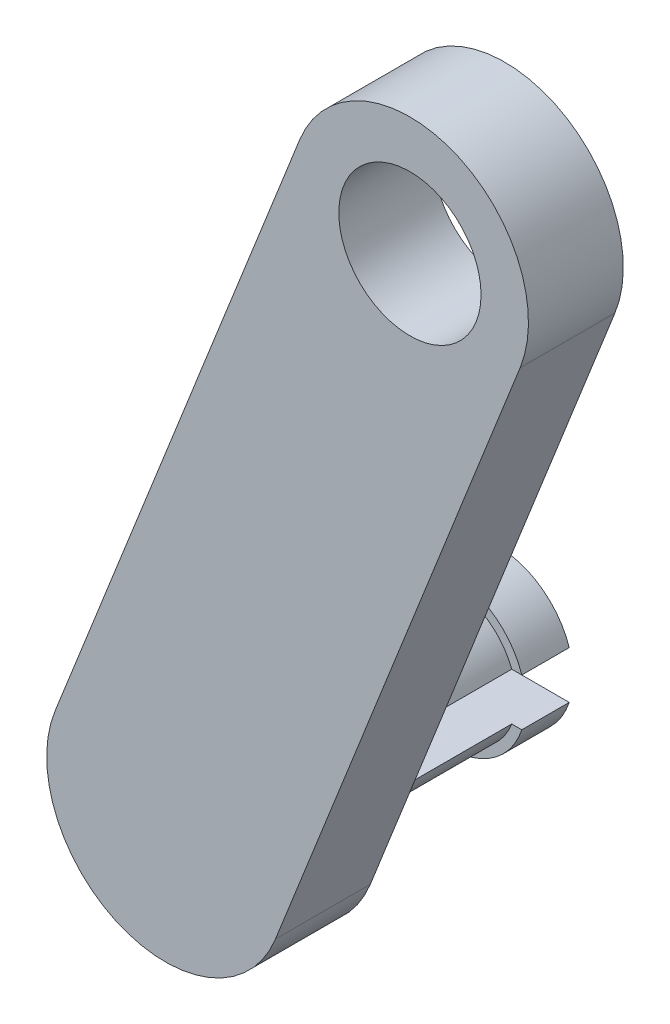
ISO-10303-21;
HEADER;
FILE_DESCRIPTION(('STEP AP214'),'2;1');
FILE_NAME('part.step','',(''),(''),'','','');
FILE_SCHEMA(('AUTOMOTIVE_DESIGN { 1 0 10303 214 1 1 1 1 }'));
ENDSEC;
DATA;
#1=APPLICATION_CONTEXT('core data for automotive mechanical design processes');
#2=APPLICATION_PROTOCOL_DEFINITION('international standard','automotive_design',2000,#1);
#3=PRODUCT_CONTEXT('',#1,'mechanical');
#4=PRODUCT('Part','Part','',(#3));
#5=PRODUCT_RELATED_PRODUCT_CATEGORY('part','',(#4));
#6=PRODUCT_DEFINITION_FORMATION('','',#4);
#7=PRODUCT_DEFINITION_CONTEXT('part definition',#1,'design');
#8=PRODUCT_DEFINITION('design','',#6,#7);
#9=PRODUCT_DEFINITION_SHAPE('','',#8);
#10=(LENGTH_UNIT() NAMED_UNIT(*) SI_UNIT(.MILLI.,.METRE.));
#11=(NAMED_UNIT(*) PLANE_ANGLE_UNIT() SI_UNIT($,.RADIAN.));
#12=(NAMED_UNIT(*) SI_UNIT($,.STERADIAN.) SOLID_ANGLE_UNIT());
#13=UNCERTAINTY_MEASURE_WITH_UNIT(LENGTH_MEASURE(1.E-05),#10,'distance_accuracy_value','');
#14=(GEOMETRIC_REPRESENTATION_CONTEXT(3) GLOBAL_UNCERTAINTY_ASSIGNED_CONTEXT((#13)) GLOBAL_UNIT_ASSIGNED_CONTEXT((#10,
#11,#12)) REPRESENTATION_CONTEXT('',''));
#15=CARTESIAN_POINT('',(0.,0.,0.));
#16=DIRECTION('',(0.,0.,1.));
#17=DIRECTION('',(1.,0.,0.));
#18=AXIS2_PLACEMENT_3D('',#15,#16,#17);
#19=CARTESIAN_POINT('',(-21.1598617150901,-14.0144468603605,-4.));
#20=DIRECTION('',(0.,0.,1.));
#21=DIRECTION('',(1.,0.,0.));
#22=AXIS2_PLACEMENT_3D('',#19,#20,#21);
#23=CYLINDRICAL_SURFACE('',#22,1.4);
#24=CARTESIAN_POINT('',(-21.1598617150901,-14.0144468603605,-4.));
#25=DIRECTION('',(0.,0.,-1.));
#26=DIRECTION('',(-1.,0.,0.));
#27=AXIS2_PLACEMENT_3D('',#24,#25,#26);
#28=CIRCLE('',#27,1.4);
#29=CARTESIAN_POINT('',(-22.4675313981523,-13.5144468603605,-4.));
#30=VERTEX_POINT('',#29);
#31=CARTESIAN_POINT('',(-19.8521920320279,-13.5144468603605,-4.));
#32=VERTEX_POINT('',#31);
#33=EDGE_CURVE('E166',#30,#32,#28,.T.);
#34=ORIENTED_EDGE('',*,*,#33,.F.);
#35=DIRECTION('',(0.,0.,1.));
#36=VECTOR('',#35,1.);
#37=CARTESIAN_POINT('',(-22.4675313981523,-13.5144468603605,-4.));
#38=LINE('',#37,#36);
#39=CARTESIAN_POINT('',(-22.4675313981523,-13.5144468603605,0.));
#40=VERTEX_POINT('',#39);
#41=EDGE_CURVE('E163',#30,#40,#38,.T.);
#42=ORIENTED_EDGE('',*,*,#41,.T.);
#43=CARTESIAN_POINT('',(-21.1598617150901,-14.0144468603605,0.));
#44=DIRECTION('',(0.,0.,1.));
#45=DIRECTION('',(1.,0.,0.));
#46=AXIS2_PLACEMENT_3D('',#43,#44,#45);
#47=CIRCLE('',#46,1.4);
#48=CARTESIAN_POINT('',(-19.8521920320279,-13.5144468603605,0.));
#49=VERTEX_POINT('',#48);
#50=EDGE_CURVE('E196',#40,#49,#47,.F.);
#51=ORIENTED_EDGE('',*,*,#50,.T.);
#52=DIRECTION('',(0.,0.,1.));
#53=VECTOR('',#52,1.);
#54=CARTESIAN_POINT('',(-19.8521920320279,-13.5144468603605,-4.));
#55=LINE('',#54,#53);
#56=EDGE_CURVE('E220',#49,#32,#55,.F.);
#57=ORIENTED_EDGE('',*,*,#56,.T.);
#58=EDGE_LOOP('',(#34,#42,#51,#57));
#59=FACE_BOUND('',#58,.T.);
#60=ADVANCED_FACE('F37',(#59),#23,.T.);
#61=CARTESIAN_POINT('',(-21.1598617150901,-14.0144468603605,-5.));
#62=DIRECTION('',(0.,0.,1.));
#63=DIRECTION('',(1.,0.,0.));
#64=AXIS2_PLACEMENT_3D('',#61,#62,#63);
#65=CYLINDRICAL_SURFACE('',#64,1.6);
#66=CARTESIAN_POINT('',(-21.1598617150901,-14.0144468603605,-5.));
#67=DIRECTION('',(0.,0.,-1.));
#68=DIRECTION('',(-1.,0.,0.));
#69=AXIS2_PLACEMENT_3D('',#66,#67,#68);
#70=CIRCLE('',#69,1.6);
#71=CARTESIAN_POINT('',(-22.6797301304472,-13.5144468603605,-5.));
#72=VERTEX_POINT('',#71);
#73=CARTESIAN_POINT('',(-19.6399932997331,-13.5144468603605,-5.));
#74=VERTEX_POINT('',#73);
#75=EDGE_CURVE('E154',#72,#74,#70,.T.);
#76=ORIENTED_EDGE('',*,*,#75,.F.);
#77=DIRECTION('',(0.,0.,1.));
#78=VECTOR('',#77,1.);
#79=CARTESIAN_POINT('',(-22.6797301304472,-13.5144468603605,-5.));
#80=LINE('',#79,#78);
#81=CARTESIAN_POINT('',(-22.6797301304472,-13.5144468603605,-4.));
#82=VERTEX_POINT('',#81);
#83=EDGE_CURVE('E218',#72,#82,#80,.T.);
#84=ORIENTED_EDGE('',*,*,#83,.T.);
#85=CARTESIAN_POINT('',(-21.1598617150901,-14.0144468603605,-4.));
#86=DIRECTION('',(0.,0.,-1.));
#87=DIRECTION('',(-1.,0.,0.));
#88=AXIS2_PLACEMENT_3D('',#85,#86,#87);
#89=CIRCLE('',#88,1.6);
#90=CARTESIAN_POINT('',(-19.6399932997331,-13.5144468603605,-4.));
#91=VERTEX_POINT('',#90);
#92=EDGE_CURVE('E155',#82,#91,#89,.T.);
#93=ORIENTED_EDGE('',*,*,#92,.T.);
#94=DIRECTION('',(0.,0.,1.));
#95=VECTOR('',#94,1.);
#96=CARTESIAN_POINT('',(-19.6399932997331,-13.5144468603605,-5.));
#97=LINE('',#96,#95);
#98=EDGE_CURVE('E217',#91,#74,#97,.F.);
#99=ORIENTED_EDGE('',*,*,#98,.T.);
#100=EDGE_LOOP('',(#76,#84,#93,#99));
#101=FACE_BOUND('',#100,.T.);
#102=ADVANCED_FACE('F216',(#101),#65,.T.);
#103=CARTESIAN_POINT('',(-21.1598617150901,-14.0144468603605,-5.));
#104=DIRECTION('',(0.,0.,-1.));
#105=DIRECTION('',(-1.,0.,0.));
#106=AXIS2_PLACEMENT_3D('',#103,#104,#105);
#107=PLANE('',#106);
#108=DIRECTION('',(1.,0.,0.));
#109=VECTOR('',#108,1.);
#110=CARTESIAN_POINT('',(-19.1598617150901,-13.5144468603605,-5.));
#111=LINE('',#110,#109);
#112=EDGE_CURVE('E151',#72,#74,#111,.T.);
#113=ORIENTED_EDGE('',*,*,#112,.F.);
#114=ORIENTED_EDGE('',*,*,#75,.T.);
#115=EDGE_LOOP('',(#113,#114));
#116=FACE_BOUND('',#115,.T.);
#117=ADVANCED_FACE('F252',(#116),#107,.T.);
#118=CARTESIAN_POINT('',(-21.1598617150901,-14.0144468603605,-4.));
#119=DIRECTION('',(0.,0.,-1.));
#120=DIRECTION('',(-1.,0.,0.));
#121=AXIS2_PLACEMENT_3D('',#118,#119,#120);
#122=PLANE('',#121);
#123=ORIENTED_EDGE('',*,*,#92,.F.);
#124=DIRECTION('',(1.,0.,0.));
#125=VECTOR('',#124,1.);
#126=CARTESIAN_POINT('',(-21.1598617150901,-13.5144468603605,-4.));
#127=LINE('',#126,#125);
#128=EDGE_CURVE('E11',#82,#30,#127,.T.);
#129=ORIENTED_EDGE('',*,*,#128,.T.);
#130=ORIENTED_EDGE('',*,*,#33,.T.);
#131=EDGE_CURVE('E41',#32,#91,#127,.T.);
#132=ORIENTED_EDGE('',*,*,#131,.T.);
#133=EDGE_LOOP('',(#123,#129,#130,#132));
#134=FACE_BOUND('',#133,.T.);
#135=ADVANCED_FACE('F208',(#134),#122,.F.);
#136=CARTESIAN_POINT('',(-16.,-1.,2.));
#137=DIRECTION('',(0.,0.,-1.));
#138=DIRECTION('',(-1.,0.,0.));
#139=AXIS2_PLACEMENT_3D('',#136,#137,#138);
#140=CYLINDRICAL_SURFACE('',#139,2.50000000000001);
#141=CARTESIAN_POINT('',(-16.,-1.,0.));
#142=DIRECTION('',(0.,0.,1.));
#143=DIRECTION('',(1.,0.,0.));
#144=AXIS2_PLACEMENT_3D('',#141,#142,#143);
#145=CIRCLE('',#144,2.50000000000001);
#146=CARTESIAN_POINT('',(-13.6759916320785,-1.92140387769467,0.));
#147=VERTEX_POINT('',#146);
#148=CARTESIAN_POINT('',(-18.3240083679215,-0.0785961223053345,0.));
#149=VERTEX_POINT('',#148);
#150=EDGE_CURVE('E180',#147,#149,#145,.T.);
#151=ORIENTED_EDGE('',*,*,#150,.T.);
#152=DIRECTION('',(0.,0.,-1.));
#153=VECTOR('',#152,1.);
#154=CARTESIAN_POINT('',(-18.3240083679215,-0.0785961223053345,2.));
#155=LINE('',#154,#153);
#156=CARTESIAN_POINT('',(-18.3240083679215,-0.0785961223053345,2.));
#157=VERTEX_POINT('',#156);
#158=EDGE_CURVE('E194',#157,#149,#155,.T.);
#159=ORIENTED_EDGE('',*,*,#158,.F.);
#160=CARTESIAN_POINT('',(-16.,-1.,2.));
#161=DIRECTION('',(0.,0.,1.));
#162=DIRECTION('',(1.,0.,0.));
#163=AXIS2_PLACEMENT_3D('',#160,#161,#162);
#164=CIRCLE('',#163,2.50000000000001);
#165=CARTESIAN_POINT('',(-13.6759916320785,-1.92140387769467,2.));
#166=VERTEX_POINT('',#165);
#167=EDGE_CURVE('E173',#166,#157,#164,.T.);
#168=ORIENTED_EDGE('',*,*,#167,.F.);
#169=DIRECTION('',(0.,0.,-1.));
#170=VECTOR('',#169,1.);
#171=CARTESIAN_POINT('',(-13.6759916320785,-1.92140387769467,2.));
#172=LINE('',#171,#170);
#173=EDGE_CURVE('E179',#166,#147,#172,.T.);
#174=ORIENTED_EDGE('',*,*,#173,.T.);
#175=EDGE_LOOP('',(#151,#159,#168,#174));
#176=FACE_BOUND('',#175,.T.);
#177=ADVANCED_FACE('F39',(#176),#140,.T.);
#178=CARTESIAN_POINT('',(-18.3240083679215,-0.0785961223053345,2.));
#179=DIRECTION('',(0.929603347168607,-0.368561551077866,0.));
#180=DIRECTION('',(0.368561551077866,0.929603347168607,0.));
#181=AXIS2_PLACEMENT_3D('',#178,#179,#180);
#182=PLANE('',#181);
#183=DIRECTION('',(-0.368561551077866,-0.929603347168607,0.));
#184=VECTOR('',#183,1.);
#185=CARTESIAN_POINT('',(-18.3240083679215,-0.0785961223053345,0.));
#186=LINE('',#185,#184);
#187=CARTESIAN_POINT('',(-23.4838700830116,-13.0930429826658,0.));
#188=VERTEX_POINT('',#187);
#189=EDGE_CURVE('E183',#149,#188,#186,.T.);
#190=ORIENTED_EDGE('',*,*,#189,.T.);
#191=DIRECTION('',(0.,0.,-1.));
#192=VECTOR('',#191,1.);
#193=CARTESIAN_POINT('',(-23.4838700830116,-13.0930429826658,2.));
#194=LINE('',#193,#192);
#195=CARTESIAN_POINT('',(-23.4838700830116,-13.0930429826658,2.));
#196=VERTEX_POINT('',#195);
#197=EDGE_CURVE('E191',#196,#188,#194,.T.);
#198=ORIENTED_EDGE('',*,*,#197,.F.);
#199=DIRECTION('',(-0.368561551077866,-0.929603347168607,0.));
#200=VECTOR('',#199,1.);
#201=CARTESIAN_POINT('',(-18.3240083679215,-0.0785961223053345,2.));
#202=LINE('',#201,#200);
#203=EDGE_CURVE('E90',#157,#196,#202,.T.);
#204=ORIENTED_EDGE('',*,*,#203,.F.);
#205=ORIENTED_EDGE('',*,*,#158,.T.);
#206=EDGE_LOOP('',(#190,#198,#204,#205));
#207=FACE_BOUND('',#206,.T.);
#208=ADVANCED_FACE('F285',(#207),#182,.F.);
#209=CARTESIAN_POINT('',(-21.1598617150901,-14.0144468603605,2.));
#210=DIRECTION('',(0.,0.,-1.));
#211=DIRECTION('',(-1.,0.,0.));
#212=AXIS2_PLACEMENT_3D('',#209,#210,#211);
#213=CYLINDRICAL_SURFACE('',#212,2.50000000000001);
#214=CARTESIAN_POINT('',(-21.1598617150901,-14.0144468603605,0.));
#215=DIRECTION('',(0.,0.,1.));
#216=DIRECTION('',(1.,0.,0.));
#217=AXIS2_PLACEMENT_3D('',#214,#215,#216);
#218=CIRCLE('',#217,2.50000000000001);
#219=CARTESIAN_POINT('',(-18.8358533471686,-14.9358507380552,0.));
#220=VERTEX_POINT('',#219);
#221=EDGE_CURVE('E185',#188,#220,#218,.T.);
#222=ORIENTED_EDGE('',*,*,#221,.T.);
#223=DIRECTION('',(0.,0.,-1.));
#224=VECTOR('',#223,1.);
#225=CARTESIAN_POINT('',(-18.8358533471686,-14.9358507380552,2.));
#226=LINE('',#225,#224);
#227=CARTESIAN_POINT('',(-18.8358533471686,-14.9358507380552,2.));
#228=VERTEX_POINT('',#227);
#229=EDGE_CURVE('E189',#228,#220,#226,.T.);
#230=ORIENTED_EDGE('',*,*,#229,.F.);
#231=CARTESIAN_POINT('',(-21.1598617150901,-14.0144468603605,2.));
#232=DIRECTION('',(0.,0.,1.));
#233=DIRECTION('',(1.,0.,0.));
#234=AXIS2_PLACEMENT_3D('',#231,#232,#233);
#235=CIRCLE('',#234,2.50000000000001);
#236=EDGE_CURVE('E176',#196,#228,#235,.T.);
#237=ORIENTED_EDGE('',*,*,#236,.F.);
#238=ORIENTED_EDGE('',*,*,#197,.T.);
#239=EDGE_LOOP('',(#222,#230,#237,#238));
#240=FACE_BOUND('',#239,.T.);
#241=ADVANCED_FACE('F283',(#240),#213,.T.);
#242=CARTESIAN_POINT('',(-13.6759916320785,-1.92140387769467,2.));
#243=DIRECTION('',(-0.929603347168607,0.368561551077866,0.));
#244=DIRECTION('',(-0.368561551077866,-0.929603347168607,0.));
#245=AXIS2_PLACEMENT_3D('',#242,#243,#244);
#246=PLANE('',#245);
#247=DIRECTION('',(0.368561551077866,0.929603347168607,0.));
#248=VECTOR('',#247,1.);
#249=CARTESIAN_POINT('',(-13.6759916320785,-1.92140387769467,0.));
#250=LINE('',#249,#248);
#251=EDGE_CURVE('E82',#220,#147,#250,.T.);
#252=ORIENTED_EDGE('',*,*,#251,.T.);
#253=ORIENTED_EDGE('',*,*,#173,.F.);
#254=DIRECTION('',(0.368561551077866,0.929603347168607,0.));
#255=VECTOR('',#254,1.);
#256=CARTESIAN_POINT('',(-13.6759916320785,-1.92140387769467,2.));
#257=LINE('',#256,#255);
#258=EDGE_CURVE('E61',#228,#166,#257,.T.);
#259=ORIENTED_EDGE('',*,*,#258,.F.);
#260=ORIENTED_EDGE('',*,*,#229,.T.);
#261=EDGE_LOOP('',(#252,#253,#259,#260));
#262=FACE_BOUND('',#261,.T.);
#263=ADVANCED_FACE('F278',(#262),#246,.F.);
#264=CARTESIAN_POINT('',(-16.,-1.,2.));
#265=DIRECTION('',(0.,0.,1.));
#266=DIRECTION('',(1.,0.,0.));
#267=AXIS2_PLACEMENT_3D('',#264,#265,#266);
#268=PLANE('',#267);
#269=CARTESIAN_POINT('',(-16.,-1.,2.));
#270=DIRECTION('',(0.,0.,1.));
#271=DIRECTION('',(1.,0.,0.));
#272=AXIS2_PLACEMENT_3D('',#269,#270,#271);
#273=CIRCLE('',#272,1.5);
#274=CARTESIAN_POINT('',(-14.5,-1.,2.));
#275=VERTEX_POINT('',#274);
#276=EDGE_CURVE('E169',#275,#275,#273,.T.);
#277=ORIENTED_EDGE('',*,*,#276,.F.);
#278=EDGE_LOOP('',(#277));
#279=FACE_BOUND('',#278,.T.);
#280=ORIENTED_EDGE('',*,*,#167,.T.);
#281=ORIENTED_EDGE('',*,*,#203,.T.);
#282=ORIENTED_EDGE('',*,*,#236,.T.);
#283=ORIENTED_EDGE('',*,*,#258,.T.);
#284=EDGE_LOOP('',(#280,#281,#282,#283));
#285=FACE_BOUND('',#284,.T.);
#286=ADVANCED_FACE('F272',(#279,#285),#268,.T.);
#287=CARTESIAN_POINT('',(-16.,-1.,0.));
#288=DIRECTION('',(0.,0.,1.));
#289=DIRECTION('',(1.,0.,0.));
#290=AXIS2_PLACEMENT_3D('',#287,#288,#289);
#291=PLANE('',#290);
#292=DIRECTION('',(1.,0.,0.));
#293=VECTOR('',#292,1.);
#294=CARTESIAN_POINT('',(-19.1598617150901,-13.5144468603605,0.));
#295=LINE('',#294,#293);
#296=EDGE_CURVE('E230',#40,#49,#295,.T.);
#297=ORIENTED_EDGE('',*,*,#296,.T.);
#298=ORIENTED_EDGE('',*,*,#50,.F.);
#299=EDGE_LOOP('',(#297,#298));
#300=FACE_BOUND('',#299,.T.);
#301=DIRECTION('',(-1.,0.,0.));
#302=VECTOR('',#301,1.);
#303=CARTESIAN_POINT('',(-19.1598617150901,-14.5144468603605,0.));
#304=LINE('',#303,#302);
#305=CARTESIAN_POINT('',(-19.8521920320279,-14.5144468603605,0.));
#306=VERTEX_POINT('',#305);
#307=CARTESIAN_POINT('',(-22.4675313981523,-14.5144468603605,0.));
#308=VERTEX_POINT('',#307);
#309=EDGE_CURVE('E231',#306,#308,#304,.T.);
#310=ORIENTED_EDGE('',*,*,#309,.T.);
#311=EDGE_CURVE('E199',#306,#308,#47,.F.);
#312=ORIENTED_EDGE('',*,*,#311,.F.);
#313=EDGE_LOOP('',(#310,#312));
#314=FACE_BOUND('',#313,.T.);
#315=CARTESIAN_POINT('',(-16.,-1.,0.));
#316=DIRECTION('',(0.,0.,1.));
#317=DIRECTION('',(1.,0.,0.));
#318=AXIS2_PLACEMENT_3D('',#315,#316,#317);
#319=CIRCLE('',#318,1.5);
#320=CARTESIAN_POINT('',(-14.5,-1.,0.));
#321=VERTEX_POINT('',#320);
#322=EDGE_CURVE('E172',#321,#321,#319,.T.);
#323=ORIENTED_EDGE('',*,*,#322,.T.);
#324=EDGE_LOOP('',(#323));
#325=FACE_BOUND('',#324,.T.);
#326=ORIENTED_EDGE('',*,*,#150,.F.);
#327=ORIENTED_EDGE('',*,*,#251,.F.);
#328=ORIENTED_EDGE('',*,*,#221,.F.);
#329=ORIENTED_EDGE('',*,*,#189,.F.);
#330=EDGE_LOOP('',(#326,#327,#328,#329));
#331=FACE_BOUND('',#330,.T.);
#332=ADVANCED_FACE('F238',(#300,#314,#325,#331),#291,.F.);
#333=CARTESIAN_POINT('',(-16.,-1.,-1.));
#334=DIRECTION('',(0.,0.,1.));
#335=DIRECTION('',(1.,0.,0.));
#336=AXIS2_PLACEMENT_3D('',#333,#334,#335);
#337=CYLINDRICAL_SURFACE('',#336,1.5);
#338=ORIENTED_EDGE('',*,*,#276,.T.);
#339=EDGE_LOOP('',(#338));
#340=FACE_BOUND('',#339,.T.);
#341=ORIENTED_EDGE('',*,*,#322,.F.);
#342=EDGE_LOOP('',(#341));
#343=FACE_BOUND('',#342,.T.);
#344=ADVANCED_FACE('F263',(#340,#343),#337,.F.);
#345=CARTESIAN_POINT('',(-19.8521920320279,-14.5144468603605,-4.));
#346=VERTEX_POINT('',#345);
#347=CARTESIAN_POINT('',(-22.4675313981523,-14.5144468603605,-4.));
#348=VERTEX_POINT('',#347);
#349=EDGE_CURVE('E158',#346,#348,#28,.T.);
#350=ORIENTED_EDGE('',*,*,#349,.F.);
#351=DIRECTION('',(0.,0.,1.));
#352=VECTOR('',#351,1.);
#353=CARTESIAN_POINT('',(-19.8521920320279,-14.5144468603605,-4.));
#354=LINE('',#353,#352);
#355=EDGE_CURVE('E144',#346,#306,#354,.T.);
#356=ORIENTED_EDGE('',*,*,#355,.T.);
#357=ORIENTED_EDGE('',*,*,#311,.T.);
#358=DIRECTION('',(0.,0.,1.));
#359=VECTOR('',#358,1.);
#360=CARTESIAN_POINT('',(-22.4675313981523,-14.5144468603605,-4.));
#361=LINE('',#360,#359);
#362=EDGE_CURVE('E145',#308,#348,#361,.F.);
#363=ORIENTED_EDGE('',*,*,#362,.T.);
#364=EDGE_LOOP('',(#350,#356,#357,#363));
#365=FACE_BOUND('',#364,.T.);
#366=ADVANCED_FACE('F241',(#365),#23,.T.);
#367=CARTESIAN_POINT('',(-19.6399932997331,-14.5144468603605,-5.));
#368=VERTEX_POINT('',#367);
#369=CARTESIAN_POINT('',(-22.6797301304472,-14.5144468603605,-5.));
#370=VERTEX_POINT('',#369);
#371=EDGE_CURVE('E150',#368,#370,#70,.T.);
#372=ORIENTED_EDGE('',*,*,#371,.F.);
#373=DIRECTION('',(0.,0.,1.));
#374=VECTOR('',#373,1.);
#375=CARTESIAN_POINT('',(-19.6399932997331,-14.5144468603605,-5.));
#376=LINE('',#375,#374);
#377=CARTESIAN_POINT('',(-19.6399932997331,-14.5144468603605,-4.));
#378=VERTEX_POINT('',#377);
#379=EDGE_CURVE('E134',#368,#378,#376,.T.);
#380=ORIENTED_EDGE('',*,*,#379,.T.);
#381=CARTESIAN_POINT('',(-22.6797301304472,-14.5144468603605,-4.));
#382=VERTEX_POINT('',#381);
#383=EDGE_CURVE('E160',#378,#382,#89,.T.);
#384=ORIENTED_EDGE('',*,*,#383,.T.);
#385=DIRECTION('',(0.,0.,1.));
#386=VECTOR('',#385,1.);
#387=CARTESIAN_POINT('',(-22.6797301304472,-14.5144468603605,-5.));
#388=LINE('',#387,#386);
#389=EDGE_CURVE('E52',#382,#370,#388,.F.);
#390=ORIENTED_EDGE('',*,*,#389,.T.);
#391=EDGE_LOOP('',(#372,#380,#384,#390));
#392=FACE_BOUND('',#391,.T.);
#393=ADVANCED_FACE('F153',(#392),#65,.T.);
#394=DIRECTION('',(-1.,0.,0.));
#395=VECTOR('',#394,1.);
#396=CARTESIAN_POINT('',(-19.1598617150901,-14.5144468603605,-5.));
#397=LINE('',#396,#395);
#398=EDGE_CURVE('E137',#368,#370,#397,.T.);
#399=ORIENTED_EDGE('',*,*,#398,.F.);
#400=ORIENTED_EDGE('',*,*,#371,.T.);
#401=EDGE_LOOP('',(#399,#400));
#402=FACE_BOUND('',#401,.T.);
#403=ADVANCED_FACE('F149',(#402),#107,.T.);
#404=ORIENTED_EDGE('',*,*,#383,.F.);
#405=DIRECTION('',(-1.,0.,0.));
#406=VECTOR('',#405,1.);
#407=CARTESIAN_POINT('',(-21.1598617150901,-14.5144468603605,-4.));
#408=LINE('',#407,#406);
#409=EDGE_CURVE('E139',#378,#346,#408,.T.);
#410=ORIENTED_EDGE('',*,*,#409,.T.);
#411=ORIENTED_EDGE('',*,*,#349,.T.);
#412=EDGE_CURVE('E201',#348,#382,#408,.T.);
#413=ORIENTED_EDGE('',*,*,#412,.T.);
#414=EDGE_LOOP('',(#404,#410,#411,#413));
#415=FACE_BOUND('',#414,.T.);
#416=ADVANCED_FACE('F242',(#415),#122,.F.);
#417=CARTESIAN_POINT('',(-19.1598617150901,-13.5144468603605,0.));
#418=DIRECTION('',(0.,1.,0.));
#419=DIRECTION('',(-1.,0.,0.));
#420=AXIS2_PLACEMENT_3D('',#417,#418,#419);
#421=PLANE('',#420);
#422=ORIENTED_EDGE('',*,*,#128,.F.);
#423=ORIENTED_EDGE('',*,*,#83,.F.);
#424=ORIENTED_EDGE('',*,*,#112,.T.);
#425=ORIENTED_EDGE('',*,*,#98,.F.);
#426=ORIENTED_EDGE('',*,*,#131,.F.);
#427=ORIENTED_EDGE('',*,*,#56,.F.);
#428=ORIENTED_EDGE('',*,*,#296,.F.);
#429=ORIENTED_EDGE('',*,*,#41,.F.);
#430=EDGE_LOOP('',(#422,#423,#424,#425,#426,#427,#428,#429));
#431=FACE_BOUND('',#430,.T.);
#432=ADVANCED_FACE('F244',(#431),#421,.F.);
#433=CARTESIAN_POINT('',(-19.1598617150901,-14.5144468603605,0.));
#434=DIRECTION('',(0.,-1.,0.));
#435=DIRECTION('',(0.,0.,-1.));
#436=AXIS2_PLACEMENT_3D('',#433,#434,#435);
#437=PLANE('',#436);
#438=ORIENTED_EDGE('',*,*,#409,.F.);
#439=ORIENTED_EDGE('',*,*,#379,.F.);
#440=ORIENTED_EDGE('',*,*,#398,.T.);
#441=ORIENTED_EDGE('',*,*,#389,.F.);
#442=ORIENTED_EDGE('',*,*,#412,.F.);
#443=ORIENTED_EDGE('',*,*,#362,.F.);
#444=ORIENTED_EDGE('',*,*,#309,.F.);
#445=ORIENTED_EDGE('',*,*,#355,.F.);
#446=EDGE_LOOP('',(#438,#439,#440,#441,#442,#443,#444,#445));
#447=FACE_BOUND('',#446,.T.);
#448=ADVANCED_FACE('F136',(#447),#437,.F.);
#449=CLOSED_SHELL('',(#60,#102,#117,#135,#177,#208,#241,#263,#286,#332,#344,#366,#393,#403,#416,
#432,#448));
#450=MANIFOLD_SOLID_BREP('B2',#449);
#451=ADVANCED_BREP_SHAPE_REPRESENTATION('',(#18,#450),#14);
#452=SHAPE_DEFINITION_REPRESENTATION(#9,#451);
ENDSEC;
END-ISO-10303-21;
